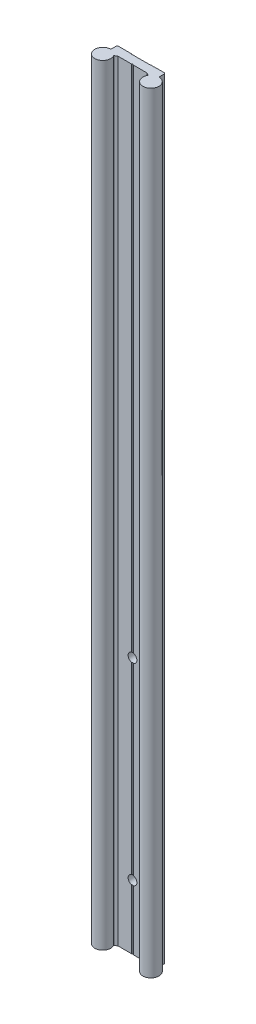
ISO-10303-21;
HEADER;
FILE_DESCRIPTION(('STEP AP214'),'2;1');
FILE_NAME('part.step','',(''),(''),'','','');
FILE_SCHEMA(('AUTOMOTIVE_DESIGN { 1 0 10303 214 1 1 1 1 }'));
ENDSEC;
DATA;
#1=APPLICATION_CONTEXT('core data for automotive mechanical design processes');
#2=APPLICATION_PROTOCOL_DEFINITION('international standard','automotive_design',2000,#1);
#3=PRODUCT_CONTEXT('',#1,'mechanical');
#4=PRODUCT('Part','Part','',(#3));
#5=PRODUCT_RELATED_PRODUCT_CATEGORY('part','',(#4));
#6=PRODUCT_DEFINITION_FORMATION('','',#4);
#7=PRODUCT_DEFINITION_CONTEXT('part definition',#1,'design');
#8=PRODUCT_DEFINITION('design','',#6,#7);
#9=PRODUCT_DEFINITION_SHAPE('','',#8);
#10=(LENGTH_UNIT() NAMED_UNIT(*) SI_UNIT(.MILLI.,.METRE.));
#11=(NAMED_UNIT(*) PLANE_ANGLE_UNIT() SI_UNIT($,.RADIAN.));
#12=(NAMED_UNIT(*) SI_UNIT($,.STERADIAN.) SOLID_ANGLE_UNIT());
#13=UNCERTAINTY_MEASURE_WITH_UNIT(LENGTH_MEASURE(1.E-05),#10,'distance_accuracy_value','');
#14=(GEOMETRIC_REPRESENTATION_CONTEXT(3) GLOBAL_UNCERTAINTY_ASSIGNED_CONTEXT((#13)) GLOBAL_UNIT_ASSIGNED_CONTEXT((#10,
#11,#12)) REPRESENTATION_CONTEXT('',''));
#15=CARTESIAN_POINT('',(0.,0.,0.));
#16=DIRECTION('',(0.,0.,1.));
#17=DIRECTION('',(1.,0.,0.));
#18=AXIS2_PLACEMENT_3D('',#15,#16,#17);
#19=CARTESIAN_POINT('',(6.85,0.,0.));
#20=DIRECTION('',(0.,0.,-1.));
#21=DIRECTION('',(-1.,0.,0.));
#22=AXIS2_PLACEMENT_3D('',#19,#20,#21);
#23=PLANE('',#22);
#24=DIRECTION('',(-1.,0.,0.));
#25=VECTOR('',#24,1.);
#26=CARTESIAN_POINT('',(6.85,0.,0.));
#27=LINE('',#26,#25);
#28=CARTESIAN_POINT('',(7.7,0.,0.));
#29=VERTEX_POINT('',#28);
#30=CARTESIAN_POINT('',(6.,0.,0.));
#31=VERTEX_POINT('',#30);
#32=EDGE_CURVE('E151',#29,#31,#27,.T.);
#33=ORIENTED_EDGE('',*,*,#32,.T.);
#34=DIRECTION('',(0.,1.,0.));
#35=VECTOR('',#34,1.);
#36=CARTESIAN_POINT('',(6.,0.,0.));
#37=LINE('',#36,#35);
#38=CARTESIAN_POINT('',(6.,480.,0.));
#39=VERTEX_POINT('',#38);
#40=EDGE_CURVE('E216',#39,#31,#37,.F.);
#41=ORIENTED_EDGE('',*,*,#40,.F.);
#42=DIRECTION('',(-1.,0.,0.));
#43=VECTOR('',#42,1.);
#44=CARTESIAN_POINT('',(7.7,480.,0.));
#45=LINE('',#44,#43);
#46=CARTESIAN_POINT('',(7.7,480.,0.));
#47=VERTEX_POINT('',#46);
#48=EDGE_CURVE('E382',#47,#39,#45,.T.);
#49=ORIENTED_EDGE('',*,*,#48,.F.);
#50=DIRECTION('',(0.,1.,0.));
#51=VECTOR('',#50,1.);
#52=CARTESIAN_POINT('',(7.7,0.,0.));
#53=LINE('',#52,#51);
#54=EDGE_CURVE('E212',#47,#29,#53,.F.);
#55=ORIENTED_EDGE('',*,*,#54,.T.);
#56=EDGE_LOOP('',(#33,#41,#49,#55));
#57=FACE_BOUND('',#56,.T.);
#58=ADVANCED_FACE('F35',(#57),#23,.T.);
#59=CARTESIAN_POINT('',(-10.2815216572,0.,6.5862970296));
#60=DIRECTION('',(0.,1.,0.));
#61=DIRECTION('',(0.,0.,1.));
#62=AXIS2_PLACEMENT_3D('',#59,#60,#61);
#63=CYLINDRICAL_SURFACE('',#62,0.29999999510001);
#64=DIRECTION('',(0.,1.,0.));
#65=VECTOR('',#64,1.);
#66=CARTESIAN_POINT('',(-10.5486053299433,0.,6.72292172997375));
#67=LINE('',#66,#65);
#68=CARTESIAN_POINT('',(-10.5486053314615,0.,6.72292172711886));
#69=VERTEX_POINT('',#68);
#70=CARTESIAN_POINT('',(-10.5486053314457,480.,6.72292172711078));
#71=VERTEX_POINT('',#70);
#72=EDGE_CURVE('E221',#69,#71,#67,.T.);
#73=ORIENTED_EDGE('',*,*,#72,.F.);
#74=CARTESIAN_POINT('',(-10.2815216572,0.,6.5862970296));
#75=DIRECTION('',(0.,1.,0.));
#76=DIRECTION('',(0.,0.,1.));
#77=AXIS2_PLACEMENT_3D('',#74,#75,#76);
#78=CIRCLE('',#77,0.29999999510001);
#79=CARTESIAN_POINT('',(-10.4315216523691,0.,6.32648941136778));
#80=VERTEX_POINT('',#79);
#81=EDGE_CURVE('E38',#80,#69,#78,.T.);
#82=ORIENTED_EDGE('',*,*,#81,.F.);
#83=DIRECTION('',(0.,1.,0.));
#84=VECTOR('',#83,1.);
#85=CARTESIAN_POINT('',(-10.43152165,0.,6.32648941));
#86=LINE('',#85,#84);
#87=CARTESIAN_POINT('',(-10.4315216523571,480.,6.32648941138856));
#88=VERTEX_POINT('',#87);
#89=EDGE_CURVE('E225',#88,#80,#86,.F.);
#90=ORIENTED_EDGE('',*,*,#89,.F.);
#91=CARTESIAN_POINT('',(-10.2815216572,480.,6.5862970296));
#92=DIRECTION('',(0.,-1.,0.));
#93=DIRECTION('',(0.,0.,1.));
#94=AXIS2_PLACEMENT_3D('',#91,#92,#93);
#95=CIRCLE('',#94,0.299999995046371);
#96=EDGE_CURVE('E310',#71,#88,#95,.T.);
#97=ORIENTED_EDGE('',*,*,#96,.F.);
#98=EDGE_LOOP('',(#73,#82,#90,#97));
#99=FACE_BOUND('',#98,.T.);
#100=ADVANCED_FACE('F308',(#99),#63,.F.);
#101=CARTESIAN_POINT('',(-15.3000000092,0.,3.7084973748));
#102=DIRECTION('',(0.,1.,0.));
#103=DIRECTION('',(0.,0.,1.));
#104=AXIS2_PLACEMENT_3D('',#101,#102,#103);
#105=CYLINDRICAL_SURFACE('',#104,0.3000000092);
#106=DIRECTION('',(0.,1.,0.));
#107=VECTOR('',#106,1.);
#108=CARTESIAN_POINT('',(-15.,0.,3.70849738000352));
#109=LINE('',#108,#107);
#110=CARTESIAN_POINT('',(-15.,0.,3.70849737740176));
#111=VERTEX_POINT('',#110);
#112=CARTESIAN_POINT('',(-15.,480.,3.70849737740176));
#113=VERTEX_POINT('',#112);
#114=EDGE_CURVE('E440',#111,#113,#109,.T.);
#115=ORIENTED_EDGE('',*,*,#114,.F.);
#116=CARTESIAN_POINT('',(-15.3000000092,0.,3.7084973748));
#117=DIRECTION('',(0.,1.,0.));
#118=DIRECTION('',(0.,0.,1.));
#119=AXIS2_PLACEMENT_3D('',#116,#117,#118);
#120=CIRCLE('',#119,0.3000000092);
#121=CARTESIAN_POINT('',(-15.2830188731145,0.,4.00801640011349));
#122=VERTEX_POINT('',#121);
#123=EDGE_CURVE('E217',#122,#111,#120,.T.);
#124=ORIENTED_EDGE('',*,*,#123,.F.);
#125=DIRECTION('',(0.,1.,0.));
#126=VECTOR('',#125,1.);
#127=CARTESIAN_POINT('',(-15.2830188699971,0.,4.00801639991588));
#128=LINE('',#127,#126);
#129=CARTESIAN_POINT('',(-15.2830188731136,480.,4.00801640012909));
#130=VERTEX_POINT('',#129);
#131=EDGE_CURVE('E314',#130,#122,#128,.F.);
#132=ORIENTED_EDGE('',*,*,#131,.F.);
#133=CARTESIAN_POINT('',(-15.3000000092,480.,3.7084973748));
#134=DIRECTION('',(0.,-1.,0.));
#135=DIRECTION('',(0.,0.,1.));
#136=AXIS2_PLACEMENT_3D('',#133,#134,#135);
#137=CIRCLE('',#136,0.30000000919479);
#138=EDGE_CURVE('E403',#113,#130,#137,.T.);
#139=ORIENTED_EDGE('',*,*,#138,.F.);
#140=EDGE_LOOP('',(#115,#124,#132,#139));
#141=FACE_BOUND('',#140,.T.);
#142=ADVANCED_FACE('F490',(#141),#105,.F.);
#143=CARTESIAN_POINT('',(-14.75,0.,0.25));
#144=DIRECTION('',(-0.707106781186548,0.,-0.707106781186548));
#145=DIRECTION('',(-0.707106781186548,0.,0.707106781186548));
#146=AXIS2_PLACEMENT_3D('',#143,#144,#145);
#147=PLANE('',#146);
#148=DIRECTION('',(-0.707106781186548,0.,0.707106781186548));
#149=VECTOR('',#148,1.);
#150=CARTESIAN_POINT('',(-14.75,0.,0.25));
#151=LINE('',#150,#149);
#152=CARTESIAN_POINT('',(-14.5,0.,0.));
#153=VERTEX_POINT('',#152);
#154=CARTESIAN_POINT('',(-15.,0.,0.5));
#155=VERTEX_POINT('',#154);
#156=EDGE_CURVE('E214',#153,#155,#151,.T.);
#157=ORIENTED_EDGE('',*,*,#156,.T.);
#158=DIRECTION('',(0.,1.,0.));
#159=VECTOR('',#158,1.);
#160=CARTESIAN_POINT('',(-15.,0.,0.5));
#161=LINE('',#160,#159);
#162=CARTESIAN_POINT('',(-15.,480.,0.5));
#163=VERTEX_POINT('',#162);
#164=EDGE_CURVE('E317',#163,#155,#161,.F.);
#165=ORIENTED_EDGE('',*,*,#164,.F.);
#166=DIRECTION('',(-0.707106781186547,0.,0.707106781186548));
#167=VECTOR('',#166,1.);
#168=CARTESIAN_POINT('',(-14.5,480.,0.));
#169=LINE('',#168,#167);
#170=CARTESIAN_POINT('',(-14.5,480.,0.));
#171=VERTEX_POINT('',#170);
#172=EDGE_CURVE('E397',#171,#163,#169,.T.);
#173=ORIENTED_EDGE('',*,*,#172,.F.);
#174=DIRECTION('',(0.,1.,0.));
#175=VECTOR('',#174,1.);
#176=CARTESIAN_POINT('',(-14.5,0.,0.));
#177=LINE('',#176,#175);
#178=EDGE_CURVE('E240',#153,#171,#177,.T.);
#179=ORIENTED_EDGE('',*,*,#178,.F.);
#180=EDGE_LOOP('',(#157,#165,#173,#179));
#181=FACE_BOUND('',#180,.T.);
#182=ADVANCED_FACE('F453',(#181),#147,.T.);
#183=CARTESIAN_POINT('',(5.9,0.,0.1));
#184=DIRECTION('',(-0.707106781186547,0.,-0.707106781186548));
#185=DIRECTION('',(-0.707106781186548,0.,0.707106781186547));
#186=AXIS2_PLACEMENT_3D('',#183,#184,#185);
#187=PLANE('',#186);
#188=DIRECTION('',(-0.707106781186548,0.,0.707106781186547));
#189=VECTOR('',#188,1.);
#190=CARTESIAN_POINT('',(5.9,0.,0.1));
#191=LINE('',#190,#189);
#192=CARTESIAN_POINT('',(5.8,0.,0.2));
#193=VERTEX_POINT('',#192);
#194=EDGE_CURVE('E213',#31,#193,#191,.T.);
#195=ORIENTED_EDGE('',*,*,#194,.T.);
#196=DIRECTION('',(0.,1.,0.));
#197=VECTOR('',#196,1.);
#198=CARTESIAN_POINT('',(5.8,0.,0.2));
#199=LINE('',#198,#197);
#200=CARTESIAN_POINT('',(5.8,480.,0.2));
#201=VERTEX_POINT('',#200);
#202=EDGE_CURVE('E276',#201,#193,#199,.F.);
#203=ORIENTED_EDGE('',*,*,#202,.F.);
#204=DIRECTION('',(-0.707106781186547,0.,0.707106781186547));
#205=VECTOR('',#204,1.);
#206=CARTESIAN_POINT('',(6.,480.,0.));
#207=LINE('',#206,#205);
#208=EDGE_CURVE('E385',#39,#201,#207,.T.);
#209=ORIENTED_EDGE('',*,*,#208,.F.);
#210=ORIENTED_EDGE('',*,*,#40,.T.);
#211=EDGE_LOOP('',(#195,#203,#209,#210));
#212=FACE_BOUND('',#211,.T.);
#213=ADVANCED_FACE('F746',(#212),#187,.T.);
#214=CARTESIAN_POINT('',(-5.9,0.,0.1));
#215=DIRECTION('',(0.707106781186547,0.,-0.707106781186548));
#216=DIRECTION('',(-0.707106781186548,0.,-0.707106781186547));
#217=AXIS2_PLACEMENT_3D('',#214,#215,#216);
#218=PLANE('',#217);
#219=DIRECTION('',(-0.707106781186548,0.,-0.707106781186547));
#220=VECTOR('',#219,1.);
#221=CARTESIAN_POINT('',(-5.9,0.,0.1));
#222=LINE('',#221,#220);
#223=CARTESIAN_POINT('',(-5.8,0.,0.2));
#224=VERTEX_POINT('',#223);
#225=CARTESIAN_POINT('',(-6.,0.,0.));
#226=VERTEX_POINT('',#225);
#227=EDGE_CURVE('E210',#224,#226,#222,.T.);
#228=ORIENTED_EDGE('',*,*,#227,.T.);
#229=DIRECTION('',(0.,1.,0.));
#230=VECTOR('',#229,1.);
#231=CARTESIAN_POINT('',(-6.,0.,0.));
#232=LINE('',#231,#230);
#233=CARTESIAN_POINT('',(-6.,480.,0.));
#234=VERTEX_POINT('',#233);
#235=EDGE_CURVE('E244',#234,#226,#232,.F.);
#236=ORIENTED_EDGE('',*,*,#235,.F.);
#237=DIRECTION('',(-0.707106781186549,0.,-0.707106781186546));
#238=VECTOR('',#237,1.);
#239=CARTESIAN_POINT('',(-5.8,480.,0.2));
#240=LINE('',#239,#238);
#241=CARTESIAN_POINT('',(-5.8,480.,0.2));
#242=VERTEX_POINT('',#241);
#243=EDGE_CURVE('E391',#242,#234,#240,.T.);
#244=ORIENTED_EDGE('',*,*,#243,.F.);
#245=DIRECTION('',(0.,1.,0.));
#246=VECTOR('',#245,1.);
#247=CARTESIAN_POINT('',(-5.8,0.,0.2));
#248=LINE('',#247,#246);
#249=EDGE_CURVE('E433',#224,#242,#248,.T.);
#250=ORIENTED_EDGE('',*,*,#249,.F.);
#251=EDGE_LOOP('',(#228,#236,#244,#250));
#252=FACE_BOUND('',#251,.T.);
#253=ADVANCED_FACE('F462',(#252),#218,.T.);
#254=CARTESIAN_POINT('',(8.,0.,0.));
#255=DIRECTION('',(0.,1.,0.));
#256=DIRECTION('',(0.,0.,1.));
#257=AXIS2_PLACEMENT_3D('',#254,#255,#256);
#258=CYLINDRICAL_SURFACE('',#257,0.300000000000001);
#259=DIRECTION('',(0.,1.,0.));
#260=VECTOR('',#259,1.);
#261=CARTESIAN_POINT('',(8.3,0.,0.));
#262=LINE('',#261,#260);
#263=CARTESIAN_POINT('',(8.3,0.,0.));
#264=VERTEX_POINT('',#263);
#265=CARTESIAN_POINT('',(8.3,480.,0.));
#266=VERTEX_POINT('',#265);
#267=EDGE_CURVE('E427',#264,#266,#262,.T.);
#268=ORIENTED_EDGE('',*,*,#267,.F.);
#269=CARTESIAN_POINT('',(8.,0.,0.));
#270=DIRECTION('',(0.,1.,0.));
#271=DIRECTION('',(0.,0.,1.));
#272=AXIS2_PLACEMENT_3D('',#269,#270,#271);
#273=CIRCLE('',#272,0.300000000000001);
#274=EDGE_CURVE('E209',#29,#264,#273,.T.);
#275=ORIENTED_EDGE('',*,*,#274,.F.);
#276=ORIENTED_EDGE('',*,*,#54,.F.);
#277=CARTESIAN_POINT('',(8.,480.,0.));
#278=DIRECTION('',(0.,-1.,0.));
#279=DIRECTION('',(0.,0.,1.));
#280=AXIS2_PLACEMENT_3D('',#277,#278,#279);
#281=CIRCLE('',#280,0.300000000000002);
#282=EDGE_CURVE('E379',#266,#47,#281,.T.);
#283=ORIENTED_EDGE('',*,*,#282,.F.);
#284=EDGE_LOOP('',(#268,#275,#276,#283));
#285=FACE_BOUND('',#284,.T.);
#286=ADVANCED_FACE('F724',(#285),#258,.F.);
#287=CARTESIAN_POINT('',(14.75,0.,0.25));
#288=DIRECTION('',(0.707106781186548,0.,-0.707106781186548));
#289=DIRECTION('',(-0.707106781186548,0.,-0.707106781186548));
#290=AXIS2_PLACEMENT_3D('',#287,#288,#289);
#291=PLANE('',#290);
#292=DIRECTION('',(-0.707106781186548,0.,-0.707106781186548));
#293=VECTOR('',#292,1.);
#294=CARTESIAN_POINT('',(14.75,0.,0.25));
#295=LINE('',#294,#293);
#296=CARTESIAN_POINT('',(15.,0.,0.5));
#297=VERTEX_POINT('',#296);
#298=CARTESIAN_POINT('',(14.5,0.,0.));
#299=VERTEX_POINT('',#298);
#300=EDGE_CURVE('E188',#297,#299,#295,.T.);
#301=ORIENTED_EDGE('',*,*,#300,.T.);
#302=DIRECTION('',(0.,1.,0.));
#303=VECTOR('',#302,1.);
#304=CARTESIAN_POINT('',(14.5,0.,0.));
#305=LINE('',#304,#303);
#306=CARTESIAN_POINT('',(14.5,480.,0.));
#307=VERTEX_POINT('',#306);
#308=EDGE_CURVE('E430',#307,#299,#305,.F.);
#309=ORIENTED_EDGE('',*,*,#308,.F.);
#310=DIRECTION('',(-0.707106781186547,0.,-0.707106781186548));
#311=VECTOR('',#310,1.);
#312=CARTESIAN_POINT('',(15.,480.,0.5));
#313=LINE('',#312,#311);
#314=CARTESIAN_POINT('',(15.,480.,0.5));
#315=VERTEX_POINT('',#314);
#316=EDGE_CURVE('E373',#315,#307,#313,.T.);
#317=ORIENTED_EDGE('',*,*,#316,.F.);
#318=DIRECTION('',(0.,1.,0.));
#319=VECTOR('',#318,1.);
#320=CARTESIAN_POINT('',(15.,0.,0.5));
#321=LINE('',#320,#319);
#322=EDGE_CURVE('E272',#297,#315,#321,.T.);
#323=ORIENTED_EDGE('',*,*,#322,.F.);
#324=EDGE_LOOP('',(#301,#309,#317,#323));
#325=FACE_BOUND('',#324,.T.);
#326=ADVANCED_FACE('F719',(#325),#291,.T.);
#327=CARTESIAN_POINT('',(0.25,0.,5.355662435));
#328=DIRECTION('',(-0.499999994031163,0.,0.866025407230548));
#329=DIRECTION('',(0.866025407230548,0.,0.499999994031163));
#330=AXIS2_PLACEMENT_3D('',#327,#328,#329);
#331=PLANE('',#330);
#332=CARTESIAN_POINT('',(0.,40.,5.21132487));
#333=DIRECTION('',(-0.499999994031163,0.,0.866025407230548));
#334=DIRECTION('',(-0.866025407230548,0.,-0.499999994031163));
#335=AXIS2_PLACEMENT_3D('',#332,#333,#334);
#336=ELLIPSE('',#335,3.17542646790721,2.75);
#337=CARTESIAN_POINT('',(0.,42.75,5.21132487));
#338=VERTEX_POINT('',#337);
#339=CARTESIAN_POINT('',(0.499999999999999,42.704163456598,5.5));
#340=VERTEX_POINT('',#339);
#341=EDGE_CURVE('E287',#338,#340,#336,.F.);
#342=ORIENTED_EDGE('',*,*,#341,.T.);
#343=DIRECTION('',(0.,1.,0.));
#344=VECTOR('',#343,1.);
#345=CARTESIAN_POINT('',(0.5,0.,5.5));
#346=LINE('',#345,#344);
#347=CARTESIAN_POINT('',(0.499999999999999,157.295836543402,5.5));
#348=VERTEX_POINT('',#347);
#349=EDGE_CURVE('E268',#348,#340,#346,.F.);
#350=ORIENTED_EDGE('',*,*,#349,.F.);
#351=CARTESIAN_POINT('',(0.,160.,5.21132487));
#352=DIRECTION('',(-0.499999994031163,0.,0.866025407230548));
#353=DIRECTION('',(-0.866025407230548,0.,-0.499999994031163));
#354=AXIS2_PLACEMENT_3D('',#351,#352,#353);
#355=ELLIPSE('',#354,3.17542646790721,2.75);
#356=CARTESIAN_POINT('',(0.,157.25,5.21132487));
#357=VERTEX_POINT('',#356);
#358=EDGE_CURVE('E224',#348,#357,#355,.F.);
#359=ORIENTED_EDGE('',*,*,#358,.T.);
#360=DIRECTION('',(0.,1.,0.));
#361=VECTOR('',#360,1.);
#362=CARTESIAN_POINT('',(0.,0.,5.21132487));
#363=LINE('',#362,#361);
#364=EDGE_CURVE('E280',#338,#357,#363,.T.);
#365=ORIENTED_EDGE('',*,*,#364,.F.);
#366=EDGE_LOOP('',(#342,#350,#359,#365));
#367=FACE_BOUND('',#366,.T.);
#368=ADVANCED_FACE('F723',(#367),#331,.T.);
#369=CARTESIAN_POINT('',(0.25,0.,5.355662435));
#370=DIRECTION('',(-0.499999994031163,0.,0.866025407230548));
#371=DIRECTION('',(0.866025407230548,0.,0.499999994031163));
#372=AXIS2_PLACEMENT_3D('',#369,#370,#371);
#373=PLANE('',#372);
#374=DIRECTION('',(0.866025407230548,0.,0.499999994031163));
#375=VECTOR('',#374,1.);
#376=CARTESIAN_POINT('',(0.25,0.,5.355662435));
#377=LINE('',#376,#375);
#378=CARTESIAN_POINT('',(0.,0.,5.21132487));
#379=VERTEX_POINT('',#378);
#380=CARTESIAN_POINT('',(0.5,0.,5.5));
#381=VERTEX_POINT('',#380);
#382=EDGE_CURVE('E132',#379,#381,#377,.T.);
#383=ORIENTED_EDGE('',*,*,#382,.T.);
#384=DIRECTION('',(0.,1.,0.));
#385=VECTOR('',#384,1.);
#386=CARTESIAN_POINT('',(0.5,0.,5.5));
#387=LINE('',#386,#385);
#388=CARTESIAN_POINT('',(0.499999999999999,37.295836543402,5.5));
#389=VERTEX_POINT('',#388);
#390=EDGE_CURVE('E183',#389,#381,#387,.F.);
#391=ORIENTED_EDGE('',*,*,#390,.F.);
#392=CARTESIAN_POINT('',(0.,40.,5.21132487));
#393=DIRECTION('',(-0.499999994031163,0.,0.866025407230548));
#394=DIRECTION('',(-0.866025407230548,0.,-0.499999994031163));
#395=AXIS2_PLACEMENT_3D('',#392,#393,#394);
#396=ELLIPSE('',#395,3.17542646790721,2.75);
#397=CARTESIAN_POINT('',(0.,37.25,5.21132487));
#398=VERTEX_POINT('',#397);
#399=EDGE_CURVE('E293',#389,#398,#396,.F.);
#400=ORIENTED_EDGE('',*,*,#399,.T.);
#401=DIRECTION('',(0.,1.,0.));
#402=VECTOR('',#401,1.);
#403=CARTESIAN_POINT('',(0.,0.,5.21132487));
#404=LINE('',#403,#402);
#405=EDGE_CURVE('E186',#379,#398,#404,.T.);
#406=ORIENTED_EDGE('',*,*,#405,.F.);
#407=EDGE_LOOP('',(#383,#391,#400,#406));
#408=FACE_BOUND('',#407,.T.);
#409=ADVANCED_FACE('F182',(#408),#373,.T.);
#410=CARTESIAN_POINT('',(9.71576082500376,0.,5.91324470500217));
#411=DIRECTION('',(-0.500000000009856,0.,0.866025403778748));
#412=DIRECTION('',(0.866025403778748,0.,0.500000000009856));
#413=AXIS2_PLACEMENT_3D('',#410,#411,#412);
#414=PLANE('',#413);
#415=DIRECTION('',(0.866025403778748,0.,0.500000000009856));
#416=VECTOR('',#415,1.);
#417=CARTESIAN_POINT('',(9.71576082500376,0.,5.91324470500217));
#418=LINE('',#417,#416);
#419=CARTESIAN_POINT('',(9.,0.,5.5));
#420=VERTEX_POINT('',#419);
#421=CARTESIAN_POINT('',(10.4315216523802,0.,6.32648941135711));
#422=VERTEX_POINT('',#421);
#423=EDGE_CURVE('E177',#420,#422,#418,.T.);
#424=ORIENTED_EDGE('',*,*,#423,.T.);
#425=DIRECTION('',(0.,1.,0.));
#426=VECTOR('',#425,1.);
#427=CARTESIAN_POINT('',(10.4315216500223,0.,6.32648940997866));
#428=LINE('',#427,#426);
#429=CARTESIAN_POINT('',(10.4315216523802,480.,6.32648941135711));
#430=VERTEX_POINT('',#429);
#431=EDGE_CURVE('E218',#422,#430,#428,.T.);
#432=ORIENTED_EDGE('',*,*,#431,.T.);
#433=DIRECTION('',(0.866025403783231,0.,0.500000000002092));
#434=VECTOR('',#433,1.);
#435=CARTESIAN_POINT('',(9.,480.,5.5));
#436=LINE('',#435,#434);
#437=CARTESIAN_POINT('',(9.,480.,5.5));
#438=VERTEX_POINT('',#437);
#439=EDGE_CURVE('E355',#438,#430,#436,.T.);
#440=ORIENTED_EDGE('',*,*,#439,.F.);
#441=DIRECTION('',(0.,1.,0.));
#442=VECTOR('',#441,1.);
#443=CARTESIAN_POINT('',(9.,0.,5.5));
#444=LINE('',#443,#442);
#445=EDGE_CURVE('E197',#420,#438,#444,.T.);
#446=ORIENTED_EDGE('',*,*,#445,.F.);
#447=EDGE_LOOP('',(#424,#432,#440,#446));
#448=FACE_BOUND('',#447,.T.);
#449=ADVANCED_FACE('F596',(#448),#414,.T.);
#450=CARTESIAN_POINT('',(0.25,0.,5.355662435));
#451=DIRECTION('',(-0.499999994031163,0.,0.866025407230548));
#452=DIRECTION('',(0.866025407230548,0.,0.499999994031163));
#453=AXIS2_PLACEMENT_3D('',#450,#451,#452);
#454=PLANE('',#453);
#455=DIRECTION('',(0.,1.,0.));
#456=VECTOR('',#455,1.);
#457=CARTESIAN_POINT('',(0.5,0.,5.5));
#458=LINE('',#457,#456);
#459=CARTESIAN_POINT('',(0.5,480.,5.5));
#460=VERTEX_POINT('',#459);
#461=CARTESIAN_POINT('',(0.499999999999999,162.704163456598,5.5));
#462=VERTEX_POINT('',#461);
#463=EDGE_CURVE('E236',#460,#462,#458,.F.);
#464=ORIENTED_EDGE('',*,*,#463,.F.);
#465=DIRECTION('',(0.866025407230549,0.,0.499999994031162));
#466=VECTOR('',#465,1.);
#467=CARTESIAN_POINT('',(0.,480.,5.21132487));
#468=LINE('',#467,#466);
#469=CARTESIAN_POINT('',(0.,480.,5.21132487));
#470=VERTEX_POINT('',#469);
#471=EDGE_CURVE('E345',#470,#460,#468,.T.);
#472=ORIENTED_EDGE('',*,*,#471,.F.);
#473=DIRECTION('',(0.,1.,0.));
#474=VECTOR('',#473,1.);
#475=CARTESIAN_POINT('',(0.,0.,5.21132487));
#476=LINE('',#475,#474);
#477=CARTESIAN_POINT('',(0.,162.75,5.21132487));
#478=VERTEX_POINT('',#477);
#479=EDGE_CURVE('E229',#478,#470,#476,.T.);
#480=ORIENTED_EDGE('',*,*,#479,.F.);
#481=CARTESIAN_POINT('',(0.,160.,5.21132487));
#482=DIRECTION('',(-0.499999994031163,0.,0.866025407230548));
#483=DIRECTION('',(-0.866025407230548,0.,-0.499999994031163));
#484=AXIS2_PLACEMENT_3D('',#481,#482,#483);
#485=ELLIPSE('',#484,3.17542646790721,2.75);
#486=EDGE_CURVE('E298',#478,#462,#485,.F.);
#487=ORIENTED_EDGE('',*,*,#486,.T.);
#488=EDGE_LOOP('',(#464,#472,#480,#487));
#489=FACE_BOUND('',#488,.T.);
#490=ADVANCED_FACE('F351',(#489),#454,.T.);
#491=CARTESIAN_POINT('',(0.,160.,2.85));
#492=DIRECTION('',(0.,0.,-1.));
#493=DIRECTION('',(-1.,0.,0.));
#494=AXIS2_PLACEMENT_3D('',#491,#492,#493);
#495=CYLINDRICAL_SURFACE('',#494,2.75);
#496=CARTESIAN_POINT('',(0.,160.,5.5));
#497=DIRECTION('',(0.,0.,-1.));
#498=DIRECTION('',(-1.,0.,0.));
#499=AXIS2_PLACEMENT_3D('',#496,#497,#498);
#500=CIRCLE('',#499,2.75);
#501=CARTESIAN_POINT('',(-0.499999999999999,157.295836543402,5.5));
#502=VERTEX_POINT('',#501);
#503=CARTESIAN_POINT('',(-0.499999999999999,162.704163456598,5.5));
#504=VERTEX_POINT('',#503);
#505=EDGE_CURVE('E264',#502,#504,#500,.T.);
#506=ORIENTED_EDGE('',*,*,#505,.F.);
#507=CARTESIAN_POINT('',(0.,160.,5.21132487));
#508=DIRECTION('',(0.499999994031163,0.,0.866025407230548));
#509=DIRECTION('',(0.866025407230548,0.,-0.499999994031163));
#510=AXIS2_PLACEMENT_3D('',#507,#508,#509);
#511=ELLIPSE('',#510,3.17542646790721,2.75);
#512=EDGE_CURVE('E284',#357,#502,#511,.F.);
#513=ORIENTED_EDGE('',*,*,#512,.F.);
#514=ORIENTED_EDGE('',*,*,#358,.F.);
#515=CARTESIAN_POINT('',(0.,160.,5.5));
#516=DIRECTION('',(0.,0.,-1.));
#517=DIRECTION('',(-1.,0.,0.));
#518=AXIS2_PLACEMENT_3D('',#515,#516,#517);
#519=CIRCLE('',#518,2.75);
#520=EDGE_CURVE('E269',#462,#348,#519,.T.);
#521=ORIENTED_EDGE('',*,*,#520,.F.);
#522=ORIENTED_EDGE('',*,*,#486,.F.);
#523=CARTESIAN_POINT('',(0.,160.,5.21132487));
#524=DIRECTION('',(0.499999994031163,0.,0.866025407230548));
#525=DIRECTION('',(0.866025407230548,0.,-0.499999994031163));
#526=AXIS2_PLACEMENT_3D('',#523,#524,#525);
#527=ELLIPSE('',#526,3.17542646790721,2.75);
#528=EDGE_CURVE('E295',#504,#478,#527,.F.);
#529=ORIENTED_EDGE('',*,*,#528,.F.);
#530=EDGE_LOOP('',(#506,#513,#514,#521,#522,#529));
#531=FACE_BOUND('',#530,.T.);
#532=CARTESIAN_POINT('',(0.,160.,0.2));
#533=DIRECTION('',(0.,0.,-1.));
#534=DIRECTION('',(-1.,0.,0.));
#535=AXIS2_PLACEMENT_3D('',#532,#533,#534);
#536=CIRCLE('',#535,2.75);
#537=CARTESIAN_POINT('',(-2.75,160.,0.2));
#538=VERTEX_POINT('',#537);
#539=EDGE_CURVE('E243',#538,#538,#536,.F.);
#540=ORIENTED_EDGE('',*,*,#539,.F.);
#541=EDGE_LOOP('',(#540));
#542=FACE_BOUND('',#541,.T.);
#543=ADVANCED_FACE('F595',(#531,#542),#495,.F.);
#544=CARTESIAN_POINT('',(-0.25,0.,5.355662435));
#545=DIRECTION('',(0.499999994031163,0.,0.866025407230548));
#546=DIRECTION('',(0.866025407230548,0.,-0.499999994031163));
#547=AXIS2_PLACEMENT_3D('',#544,#545,#546);
#548=PLANE('',#547);
#549=ORIENTED_EDGE('',*,*,#479,.T.);
#550=DIRECTION('',(0.866025407230549,0.,-0.499999994031162));
#551=VECTOR('',#550,1.);
#552=CARTESIAN_POINT('',(-0.5,480.,5.5));
#553=LINE('',#552,#551);
#554=CARTESIAN_POINT('',(-0.5,480.,5.5));
#555=VERTEX_POINT('',#554);
#556=EDGE_CURVE('E335',#555,#470,#553,.T.);
#557=ORIENTED_EDGE('',*,*,#556,.F.);
#558=DIRECTION('',(0.,1.,0.));
#559=VECTOR('',#558,1.);
#560=CARTESIAN_POINT('',(-0.5,0.,5.5));
#561=LINE('',#560,#559);
#562=EDGE_CURVE('E234',#504,#555,#561,.T.);
#563=ORIENTED_EDGE('',*,*,#562,.F.);
#564=ORIENTED_EDGE('',*,*,#528,.T.);
#565=EDGE_LOOP('',(#549,#557,#563,#564));
#566=FACE_BOUND('',#565,.T.);
#567=ADVANCED_FACE('F332',(#566),#548,.T.);
#568=CARTESIAN_POINT('',(-9.715760825,0.,5.913244705));
#569=DIRECTION('',(0.500000000009856,0.,0.866025403778748));
#570=DIRECTION('',(0.866025403778748,0.,-0.500000000009856));
#571=AXIS2_PLACEMENT_3D('',#568,#569,#570);
#572=PLANE('',#571);
#573=DIRECTION('',(0.866025403778748,0.,-0.500000000009856));
#574=VECTOR('',#573,1.);
#575=CARTESIAN_POINT('',(-9.715760825,0.,5.913244705));
#576=LINE('',#575,#574);
#577=CARTESIAN_POINT('',(-9.,0.,5.5));
#578=VERTEX_POINT('',#577);
#579=EDGE_CURVE('E228',#80,#578,#576,.T.);
#580=ORIENTED_EDGE('',*,*,#579,.T.);
#581=DIRECTION('',(0.,1.,0.));
#582=VECTOR('',#581,1.);
#583=CARTESIAN_POINT('',(-9.,0.,5.5));
#584=LINE('',#583,#582);
#585=CARTESIAN_POINT('',(-9.,480.,5.5));
#586=VERTEX_POINT('',#585);
#587=EDGE_CURVE('E160',#586,#578,#584,.F.);
#588=ORIENTED_EDGE('',*,*,#587,.F.);
#589=DIRECTION('',(0.866025403775453,0.,-0.500000000015564));
#590=VECTOR('',#589,1.);
#591=CARTESIAN_POINT('',(-10.4315216523636,480.,6.32648941137722));
#592=LINE('',#591,#590);
#593=EDGE_CURVE('E239',#88,#586,#592,.T.);
#594=ORIENTED_EDGE('',*,*,#593,.F.);
#595=ORIENTED_EDGE('',*,*,#89,.T.);
#596=EDGE_LOOP('',(#580,#588,#594,#595));
#597=FACE_BOUND('',#596,.T.);
#598=ADVANCED_FACE('F607',(#597),#572,.T.);
#599=CARTESIAN_POINT('',(-0.25,0.,5.355662435));
#600=DIRECTION('',(0.499999994031163,0.,0.866025407230548));
#601=DIRECTION('',(0.866025407230548,0.,-0.499999994031163));
#602=AXIS2_PLACEMENT_3D('',#599,#600,#601);
#603=PLANE('',#602);
#604=DIRECTION('',(0.866025407230548,0.,-0.499999994031163));
#605=VECTOR('',#604,1.);
#606=CARTESIAN_POINT('',(-0.25,0.,5.355662435));
#607=LINE('',#606,#605);
#608=CARTESIAN_POINT('',(-0.5,0.,5.5));
#609=VERTEX_POINT('',#608);
#610=EDGE_CURVE('E231',#609,#379,#607,.T.);
#611=ORIENTED_EDGE('',*,*,#610,.T.);
#612=ORIENTED_EDGE('',*,*,#405,.T.);
#613=CARTESIAN_POINT('',(0.,40.,5.21132487));
#614=DIRECTION('',(0.499999994031163,0.,0.866025407230548));
#615=DIRECTION('',(0.866025407230548,0.,-0.499999994031163));
#616=AXIS2_PLACEMENT_3D('',#613,#614,#615);
#617=ELLIPSE('',#616,3.17542646790721,2.75);
#618=CARTESIAN_POINT('',(-0.499999999999999,37.295836543402,5.5));
#619=VERTEX_POINT('',#618);
#620=EDGE_CURVE('E290',#398,#619,#617,.F.);
#621=ORIENTED_EDGE('',*,*,#620,.T.);
#622=DIRECTION('',(0.,1.,0.));
#623=VECTOR('',#622,1.);
#624=CARTESIAN_POINT('',(-0.5,0.,5.5));
#625=LINE('',#624,#623);
#626=EDGE_CURVE('E233',#609,#619,#625,.T.);
#627=ORIENTED_EDGE('',*,*,#626,.F.);
#628=EDGE_LOOP('',(#611,#612,#621,#627));
#629=FACE_BOUND('',#628,.T.);
#630=ADVANCED_FACE('F632',(#629),#603,.T.);
#631=CARTESIAN_POINT('',(0.,40.,2.85));
#632=DIRECTION('',(0.,0.,-1.));
#633=DIRECTION('',(-1.,0.,0.));
#634=AXIS2_PLACEMENT_3D('',#631,#632,#633);
#635=CYLINDRICAL_SURFACE('',#634,2.75);
#636=CARTESIAN_POINT('',(0.,40.,5.5));
#637=DIRECTION('',(0.,0.,-1.));
#638=DIRECTION('',(-1.,0.,0.));
#639=AXIS2_PLACEMENT_3D('',#636,#637,#638);
#640=CIRCLE('',#639,2.75);
#641=CARTESIAN_POINT('',(-0.499999999999999,42.704163456598,5.5));
#642=VERTEX_POINT('',#641);
#643=EDGE_CURVE('E260',#619,#642,#640,.T.);
#644=ORIENTED_EDGE('',*,*,#643,.F.);
#645=ORIENTED_EDGE('',*,*,#620,.F.);
#646=ORIENTED_EDGE('',*,*,#399,.F.);
#647=CARTESIAN_POINT('',(0.,40.,5.5));
#648=DIRECTION('',(0.,0.,-1.));
#649=DIRECTION('',(-1.,0.,0.));
#650=AXIS2_PLACEMENT_3D('',#647,#648,#649);
#651=CIRCLE('',#650,2.75);
#652=EDGE_CURVE('E196',#340,#389,#651,.T.);
#653=ORIENTED_EDGE('',*,*,#652,.F.);
#654=ORIENTED_EDGE('',*,*,#341,.F.);
#655=CARTESIAN_POINT('',(0.,40.,5.21132487));
#656=DIRECTION('',(0.499999994031163,0.,0.866025407230548));
#657=DIRECTION('',(0.866025407230548,0.,-0.499999994031163));
#658=AXIS2_PLACEMENT_3D('',#655,#656,#657);
#659=ELLIPSE('',#658,3.17542646790721,2.75);
#660=EDGE_CURVE('E281',#642,#338,#659,.F.);
#661=ORIENTED_EDGE('',*,*,#660,.F.);
#662=EDGE_LOOP('',(#644,#645,#646,#653,#654,#661));
#663=FACE_BOUND('',#662,.T.);
#664=CARTESIAN_POINT('',(0.,40.,0.2));
#665=DIRECTION('',(0.,0.,-1.));
#666=DIRECTION('',(-1.,0.,0.));
#667=AXIS2_PLACEMENT_3D('',#664,#665,#666);
#668=CIRCLE('',#667,2.75);
#669=CARTESIAN_POINT('',(-2.75,40.,0.2));
#670=VERTEX_POINT('',#669);
#671=EDGE_CURVE('E273',#670,#670,#668,.F.);
#672=ORIENTED_EDGE('',*,*,#671,.F.);
#673=EDGE_LOOP('',(#672));
#674=FACE_BOUND('',#673,.T.);
#675=ADVANCED_FACE('F628',(#663,#674),#635,.F.);
#676=CARTESIAN_POINT('',(-0.25,0.,5.355662435));
#677=DIRECTION('',(0.499999994031163,0.,0.866025407230548));
#678=DIRECTION('',(0.866025407230548,0.,-0.499999994031163));
#679=AXIS2_PLACEMENT_3D('',#676,#677,#678);
#680=PLANE('',#679);
#681=ORIENTED_EDGE('',*,*,#660,.T.);
#682=ORIENTED_EDGE('',*,*,#364,.T.);
#683=ORIENTED_EDGE('',*,*,#512,.T.);
#684=DIRECTION('',(0.,1.,0.));
#685=VECTOR('',#684,1.);
#686=CARTESIAN_POINT('',(-0.5,0.,5.5));
#687=LINE('',#686,#685);
#688=EDGE_CURVE('E263',#642,#502,#687,.T.);
#689=ORIENTED_EDGE('',*,*,#688,.F.);
#690=EDGE_LOOP('',(#681,#682,#683,#689));
#691=FACE_BOUND('',#690,.T.);
#692=ADVANCED_FACE('F500',(#691),#680,.T.);
#693=CARTESIAN_POINT('',(10.2815216572,0.,6.5862970296));
#694=DIRECTION('',(0.,1.,0.));
#695=DIRECTION('',(0.,0.,1.));
#696=AXIS2_PLACEMENT_3D('',#693,#694,#695);
#697=CYLINDRICAL_SURFACE('',#696,0.299999995100002);
#698=ORIENTED_EDGE('',*,*,#431,.F.);
#699=CARTESIAN_POINT('',(10.2815216572,0.,6.5862970296));
#700=DIRECTION('',(0.,1.,0.));
#701=DIRECTION('',(0.,0.,1.));
#702=AXIS2_PLACEMENT_3D('',#699,#700,#701);
#703=CIRCLE('',#702,0.299999995100002);
#704=CARTESIAN_POINT('',(10.54860533147,0.,6.72292172710227));
#705=VERTEX_POINT('',#704);
#706=EDGE_CURVE('E222',#705,#422,#703,.T.);
#707=ORIENTED_EDGE('',*,*,#706,.F.);
#708=DIRECTION('',(0.,1.,0.));
#709=VECTOR('',#708,1.);
#710=CARTESIAN_POINT('',(10.5486053299603,0.,6.72292172994058));
#711=LINE('',#710,#709);
#712=CARTESIAN_POINT('',(10.5486053314944,480.,6.72292172711478));
#713=VERTEX_POINT('',#712);
#714=EDGE_CURVE('E325',#713,#705,#711,.F.);
#715=ORIENTED_EDGE('',*,*,#714,.F.);
#716=CARTESIAN_POINT('',(10.2815216572,480.,6.5862970296));
#717=DIRECTION('',(0.,-1.,0.));
#718=DIRECTION('',(0.,0.,1.));
#719=AXIS2_PLACEMENT_3D('',#716,#717,#718);
#720=CIRCLE('',#719,0.299999995076031);
#721=EDGE_CURVE('E361',#430,#713,#720,.T.);
#722=ORIENTED_EDGE('',*,*,#721,.F.);
#723=EDGE_LOOP('',(#698,#707,#715,#722));
#724=FACE_BOUND('',#723,.T.);
#725=ADVANCED_FACE('F493',(#724),#697,.F.);
#726=CARTESIAN_POINT('',(-15.0000000021,0.,9.00000000590001));
#727=DIRECTION('',(0.,1.,0.));
#728=DIRECTION('',(0.,0.,1.));
#729=AXIS2_PLACEMENT_3D('',#726,#727,#728);
#730=CYLINDRICAL_SURFACE('',#729,5.00000000020001);
#731=ORIENTED_EDGE('',*,*,#131,.T.);
#732=CARTESIAN_POINT('',(-15.0000000021,0.,9.00000000590001));
#733=DIRECTION('',(0.,1.,0.));
#734=DIRECTION('',(0.,0.,1.));
#735=AXIS2_PLACEMENT_3D('',#732,#733,#734);
#736=CIRCLE('',#735,5.00000000020001);
#737=EDGE_CURVE('E256',#69,#122,#736,.F.);
#738=ORIENTED_EDGE('',*,*,#737,.F.);
#739=ORIENTED_EDGE('',*,*,#72,.T.);
#740=CARTESIAN_POINT('',(-15.0000000021,480.,9.00000000590001));
#741=DIRECTION('',(0.,1.,0.));
#742=DIRECTION('',(0.,0.,1.));
#743=AXIS2_PLACEMENT_3D('',#740,#741,#742);
#744=CIRCLE('',#743,5.00000000016631);
#745=EDGE_CURVE('E406',#130,#71,#744,.T.);
#746=ORIENTED_EDGE('',*,*,#745,.F.);
#747=EDGE_LOOP('',(#731,#738,#739,#746));
#748=FACE_BOUND('',#747,.T.);
#749=ADVANCED_FACE('F491',(#748),#730,.T.);
#750=CARTESIAN_POINT('',(-15.,0.,2.10424869000176));
#751=DIRECTION('',(-1.,0.,0.));
#752=DIRECTION('',(0.,0.,1.));
#753=AXIS2_PLACEMENT_3D('',#750,#751,#752);
#754=PLANE('',#753);
#755=DIRECTION('',(0.,0.,-1.));
#756=VECTOR('',#755,1.);
#757=CARTESIAN_POINT('',(-15.,0.,5.64598755786158));
#758=LINE('',#757,#756);
#759=EDGE_CURVE('E249',#111,#155,#758,.T.);
#760=ORIENTED_EDGE('',*,*,#759,.F.);
#761=ORIENTED_EDGE('',*,*,#114,.T.);
#762=DIRECTION('',(0.,0.,1.));
#763=VECTOR('',#762,1.);
#764=CARTESIAN_POINT('',(-15.,480.,0.5));
#765=LINE('',#764,#763);
#766=EDGE_CURVE('E400',#163,#113,#765,.T.);
#767=ORIENTED_EDGE('',*,*,#766,.F.);
#768=ORIENTED_EDGE('',*,*,#164,.T.);
#769=EDGE_LOOP('',(#760,#761,#767,#768));
#770=FACE_BOUND('',#769,.T.);
#771=ADVANCED_FACE('F447',(#770),#754,.T.);
#772=CARTESIAN_POINT('',(-10.25,0.,0.));
#773=DIRECTION('',(0.,0.,-1.));
#774=DIRECTION('',(-1.,0.,0.));
#775=AXIS2_PLACEMENT_3D('',#772,#773,#774);
#776=PLANE('',#775);
#777=DIRECTION('',(1.,0.,0.));
#778=VECTOR('',#777,1.);
#779=CARTESIAN_POINT('',(0.024483142185321,0.,0.));
#780=LINE('',#779,#778);
#781=EDGE_CURVE('E245',#153,#226,#780,.T.);
#782=ORIENTED_EDGE('',*,*,#781,.F.);
#783=ORIENTED_EDGE('',*,*,#178,.T.);
#784=DIRECTION('',(-1.,0.,0.));
#785=VECTOR('',#784,1.);
#786=CARTESIAN_POINT('',(-6.,480.,0.));
#787=LINE('',#786,#785);
#788=EDGE_CURVE('E394',#234,#171,#787,.T.);
#789=ORIENTED_EDGE('',*,*,#788,.F.);
#790=ORIENTED_EDGE('',*,*,#235,.T.);
#791=EDGE_LOOP('',(#782,#783,#789,#790));
#792=FACE_BOUND('',#791,.T.);
#793=ADVANCED_FACE('F457',(#792),#776,.T.);
#794=CARTESIAN_POINT('',(0.,0.,0.2));
#795=DIRECTION('',(0.,0.,-1.));
#796=DIRECTION('',(-1.,0.,0.));
#797=AXIS2_PLACEMENT_3D('',#794,#795,#796);
#798=PLANE('',#797);
#799=DIRECTION('',(1.,0.,0.));
#800=VECTOR('',#799,1.);
#801=CARTESIAN_POINT('',(0.024483142185321,0.,0.2));
#802=LINE('',#801,#800);
#803=EDGE_CURVE('E248',#224,#193,#802,.T.);
#804=ORIENTED_EDGE('',*,*,#803,.F.);
#805=ORIENTED_EDGE('',*,*,#249,.T.);
#806=DIRECTION('',(-1.,0.,0.));
#807=VECTOR('',#806,1.);
#808=CARTESIAN_POINT('',(5.8,480.,0.2));
#809=LINE('',#808,#807);
#810=EDGE_CURVE('E388',#201,#242,#809,.T.);
#811=ORIENTED_EDGE('',*,*,#810,.F.);
#812=ORIENTED_EDGE('',*,*,#202,.T.);
#813=EDGE_LOOP('',(#804,#805,#811,#812));
#814=FACE_BOUND('',#813,.T.);
#815=ORIENTED_EDGE('',*,*,#671,.T.);
#816=EDGE_LOOP('',(#815));
#817=FACE_BOUND('',#816,.T.);
#818=ORIENTED_EDGE('',*,*,#539,.T.);
#819=EDGE_LOOP('',(#818));
#820=FACE_BOUND('',#819,.T.);
#821=ADVANCED_FACE('F472',(#814,#817,#820),#798,.T.);
#822=CARTESIAN_POINT('',(11.4,0.,0.));
#823=DIRECTION('',(0.,0.,-1.));
#824=DIRECTION('',(-1.,0.,0.));
#825=AXIS2_PLACEMENT_3D('',#822,#823,#824);
#826=PLANE('',#825);
#827=DIRECTION('',(1.,0.,0.));
#828=VECTOR('',#827,1.);
#829=CARTESIAN_POINT('',(0.024483142185321,0.,0.));
#830=LINE('',#829,#828);
#831=EDGE_CURVE('E204',#264,#299,#830,.T.);
#832=ORIENTED_EDGE('',*,*,#831,.F.);
#833=ORIENTED_EDGE('',*,*,#267,.T.);
#834=DIRECTION('',(-1.,0.,0.));
#835=VECTOR('',#834,1.);
#836=CARTESIAN_POINT('',(14.5,480.,0.));
#837=LINE('',#836,#835);
#838=EDGE_CURVE('E376',#307,#266,#837,.T.);
#839=ORIENTED_EDGE('',*,*,#838,.F.);
#840=ORIENTED_EDGE('',*,*,#308,.T.);
#841=EDGE_LOOP('',(#832,#833,#839,#840));
#842=FACE_BOUND('',#841,.T.);
#843=ADVANCED_FACE('F527',(#842),#826,.T.);
#844=CARTESIAN_POINT('',(15.,0.,2.10424869));
#845=DIRECTION('',(1.,0.,0.));
#846=DIRECTION('',(0.,0.,-1.));
#847=AXIS2_PLACEMENT_3D('',#844,#845,#846);
#848=PLANE('',#847);
#849=DIRECTION('',(0.,0.,-1.));
#850=VECTOR('',#849,1.);
#851=CARTESIAN_POINT('',(15.,0.,5.64598755786158));
#852=LINE('',#851,#850);
#853=CARTESIAN_POINT('',(15.,0.,3.70849738655));
#854=VERTEX_POINT('',#853);
#855=EDGE_CURVE('E201',#297,#854,#852,.F.);
#856=ORIENTED_EDGE('',*,*,#855,.F.);
#857=ORIENTED_EDGE('',*,*,#322,.T.);
#858=DIRECTION('',(-8.16566931533308E-12,0.,-1.));
#859=VECTOR('',#858,1.);
#860=CARTESIAN_POINT('',(15.0000000000262,480.,3.70849738655));
#861=LINE('',#860,#859);
#862=CARTESIAN_POINT('',(15.0000000000395,480.,3.70849738655));
#863=VERTEX_POINT('',#862);
#864=EDGE_CURVE('E370',#863,#315,#861,.T.);
#865=ORIENTED_EDGE('',*,*,#864,.F.);
#866=DIRECTION('',(0.,1.,0.));
#867=VECTOR('',#866,1.);
#868=CARTESIAN_POINT('',(15.,0.,3.70849738));
#869=LINE('',#868,#867);
#870=EDGE_CURVE('E200',#863,#854,#869,.F.);
#871=ORIENTED_EDGE('',*,*,#870,.T.);
#872=EDGE_LOOP('',(#856,#857,#865,#871));
#873=FACE_BOUND('',#872,.T.);
#874=ADVANCED_FACE('F524',(#873),#848,.T.);
#875=CARTESIAN_POINT('',(4.75,0.,5.5));
#876=DIRECTION('',(0.,0.,1.));
#877=DIRECTION('',(1.,0.,0.));
#878=AXIS2_PLACEMENT_3D('',#875,#876,#877);
#879=PLANE('',#878);
#880=ORIENTED_EDGE('',*,*,#445,.T.);
#881=DIRECTION('',(1.,0.,0.));
#882=VECTOR('',#881,1.);
#883=CARTESIAN_POINT('',(0.5,480.,5.5));
#884=LINE('',#883,#882);
#885=EDGE_CURVE('E353',#460,#438,#884,.T.);
#886=ORIENTED_EDGE('',*,*,#885,.F.);
#887=ORIENTED_EDGE('',*,*,#463,.T.);
#888=ORIENTED_EDGE('',*,*,#520,.T.);
#889=ORIENTED_EDGE('',*,*,#349,.T.);
#890=ORIENTED_EDGE('',*,*,#652,.T.);
#891=ORIENTED_EDGE('',*,*,#390,.T.);
#892=DIRECTION('',(1.,0.,0.));
#893=VECTOR('',#892,1.);
#894=CARTESIAN_POINT('',(0.024483142185321,0.,5.5));
#895=LINE('',#894,#893);
#896=EDGE_CURVE('E194',#420,#381,#895,.F.);
#897=ORIENTED_EDGE('',*,*,#896,.F.);
#898=EDGE_LOOP('',(#880,#886,#887,#888,#889,#890,#891,#897));
#899=FACE_BOUND('',#898,.T.);
#900=ADVANCED_FACE('F193',(#899),#879,.T.);
#901=CARTESIAN_POINT('',(-4.75,0.,5.5));
#902=DIRECTION('',(0.,0.,1.));
#903=DIRECTION('',(1.,0.,0.));
#904=AXIS2_PLACEMENT_3D('',#901,#902,#903);
#905=PLANE('',#904);
#906=ORIENTED_EDGE('',*,*,#643,.T.);
#907=ORIENTED_EDGE('',*,*,#688,.T.);
#908=ORIENTED_EDGE('',*,*,#505,.T.);
#909=ORIENTED_EDGE('',*,*,#562,.T.);
#910=DIRECTION('',(1.,0.,0.));
#911=VECTOR('',#910,1.);
#912=CARTESIAN_POINT('',(-9.,480.,5.5));
#913=LINE('',#912,#911);
#914=EDGE_CURVE('E348',#586,#555,#913,.T.);
#915=ORIENTED_EDGE('',*,*,#914,.F.);
#916=ORIENTED_EDGE('',*,*,#587,.T.);
#917=DIRECTION('',(1.,0.,0.));
#918=VECTOR('',#917,1.);
#919=CARTESIAN_POINT('',(0.024483142185321,0.,5.5));
#920=LINE('',#919,#918);
#921=EDGE_CURVE('E259',#609,#578,#920,.F.);
#922=ORIENTED_EDGE('',*,*,#921,.F.);
#923=ORIENTED_EDGE('',*,*,#626,.T.);
#924=EDGE_LOOP('',(#906,#907,#908,#909,#915,#916,#922,#923));
#925=FACE_BOUND('',#924,.T.);
#926=ADVANCED_FACE('F518',(#925),#905,.T.);
#927=CARTESIAN_POINT('',(0.024483142185321,0.,5.64598755786158));
#928=DIRECTION('',(0.,-1.,0.));
#929=DIRECTION('',(0.,0.,-1.));
#930=AXIS2_PLACEMENT_3D('',#927,#928,#929);
#931=PLANE('',#930);
#932=ORIENTED_EDGE('',*,*,#896,.T.);
#933=ORIENTED_EDGE('',*,*,#382,.F.);
#934=ORIENTED_EDGE('',*,*,#610,.F.);
#935=ORIENTED_EDGE('',*,*,#921,.T.);
#936=ORIENTED_EDGE('',*,*,#579,.F.);
#937=ORIENTED_EDGE('',*,*,#81,.T.);
#938=ORIENTED_EDGE('',*,*,#737,.T.);
#939=ORIENTED_EDGE('',*,*,#123,.T.);
#940=ORIENTED_EDGE('',*,*,#759,.T.);
#941=ORIENTED_EDGE('',*,*,#156,.F.);
#942=ORIENTED_EDGE('',*,*,#781,.T.);
#943=ORIENTED_EDGE('',*,*,#227,.F.);
#944=ORIENTED_EDGE('',*,*,#803,.T.);
#945=ORIENTED_EDGE('',*,*,#194,.F.);
#946=ORIENTED_EDGE('',*,*,#32,.F.);
#947=ORIENTED_EDGE('',*,*,#274,.T.);
#948=ORIENTED_EDGE('',*,*,#831,.T.);
#949=ORIENTED_EDGE('',*,*,#300,.F.);
#950=ORIENTED_EDGE('',*,*,#855,.T.);
#951=CARTESIAN_POINT('',(15.2999999899,0.,3.7084973931));
#952=DIRECTION('',(0.,1.,0.));
#953=DIRECTION('',(0.,0.,1.));
#954=AXIS2_PLACEMENT_3D('',#951,#952,#953);
#955=CIRCLE('',#954,0.299999989899998);
#956=CARTESIAN_POINT('',(15.2830188645267,0.,4.00801639965822));
#957=VERTEX_POINT('',#956);
#958=EDGE_CURVE('E53',#854,#957,#955,.T.);
#959=ORIENTED_EDGE('',*,*,#958,.T.);
#960=CARTESIAN_POINT('',(15.0000000021,0.,9.0000000059));
#961=DIRECTION('',(0.,1.,0.));
#962=DIRECTION('',(0.,0.,1.));
#963=AXIS2_PLACEMENT_3D('',#960,#961,#962);
#964=CIRCLE('',#963,5.0000000002);
#965=EDGE_CURVE('E44',#705,#957,#964,.T.);
#966=ORIENTED_EDGE('',*,*,#965,.F.);
#967=ORIENTED_EDGE('',*,*,#706,.T.);
#968=ORIENTED_EDGE('',*,*,#423,.F.);
#969=EDGE_LOOP('',(#932,#933,#934,#935,#936,#937,#938,#939,#940,#941,#942,#943,#944,#945,#946,
#947,#948,#949,#950,#959,#966,#967,#968));
#970=FACE_BOUND('',#969,.T.);
#971=ADVANCED_FACE('F199',(#970),#931,.T.);
#972=CARTESIAN_POINT('',(15.2999999899,0.,3.7084973931));
#973=DIRECTION('',(0.,1.,0.));
#974=DIRECTION('',(0.,0.,1.));
#975=AXIS2_PLACEMENT_3D('',#972,#973,#974);
#976=CYLINDRICAL_SURFACE('',#975,0.299999989899998);
#977=DIRECTION('',(0.,1.,0.));
#978=VECTOR('',#977,1.);
#979=CARTESIAN_POINT('',(15.2830188699987,0.,4.00801639991597));
#980=LINE('',#979,#978);
#981=CARTESIAN_POINT('',(15.2830188645263,480.,4.00801639966663));
#982=VERTEX_POINT('',#981);
#983=EDGE_CURVE('E12',#957,#982,#980,.T.);
#984=ORIENTED_EDGE('',*,*,#983,.F.);
#985=ORIENTED_EDGE('',*,*,#958,.F.);
#986=ORIENTED_EDGE('',*,*,#870,.F.);
#987=CARTESIAN_POINT('',(15.2999999899,480.,3.7084973931));
#988=DIRECTION('',(0.,-1.,0.));
#989=DIRECTION('',(0.,0.,1.));
#990=AXIS2_PLACEMENT_3D('',#987,#988,#989);
#991=CIRCLE('',#990,0.299999989860461);
#992=EDGE_CURVE('E367',#982,#863,#991,.T.);
#993=ORIENTED_EDGE('',*,*,#992,.F.);
#994=EDGE_LOOP('',(#984,#985,#986,#993));
#995=FACE_BOUND('',#994,.T.);
#996=ADVANCED_FACE('F505',(#995),#976,.F.);
#997=CARTESIAN_POINT('',(15.0000000021,0.,9.0000000059));
#998=DIRECTION('',(0.,1.,0.));
#999=DIRECTION('',(0.,0.,1.));
#1000=AXIS2_PLACEMENT_3D('',#997,#998,#999);
#1001=CYLINDRICAL_SURFACE('',#1000,5.0000000002);
#1002=ORIENTED_EDGE('',*,*,#983,.T.);
#1003=CARTESIAN_POINT('',(15.0000000021,480.,9.0000000059));
#1004=DIRECTION('',(0.,1.,0.));
#1005=DIRECTION('',(0.,0.,1.));
#1006=AXIS2_PLACEMENT_3D('',#1003,#1004,#1005);
#1007=CIRCLE('',#1006,5.00000000013918);
#1008=EDGE_CURVE('E364',#713,#982,#1007,.T.);
#1009=ORIENTED_EDGE('',*,*,#1008,.F.);
#1010=ORIENTED_EDGE('',*,*,#714,.T.);
#1011=ORIENTED_EDGE('',*,*,#965,.T.);
#1012=EDGE_LOOP('',(#1002,#1009,#1010,#1011));
#1013=FACE_BOUND('',#1012,.T.);
#1014=ADVANCED_FACE('F503',(#1013),#1001,.T.);
#1015=CARTESIAN_POINT('',(10.2815216572,480.,6.5862970296));
#1016=DIRECTION('',(0.,1.,0.));
#1017=DIRECTION('',(0.,0.,1.));
#1018=AXIS2_PLACEMENT_3D('',#1015,#1016,#1017);
#1019=PLANE('',#1018);
#1020=ORIENTED_EDGE('',*,*,#914,.T.);
#1021=ORIENTED_EDGE('',*,*,#556,.T.);
#1022=ORIENTED_EDGE('',*,*,#471,.T.);
#1023=ORIENTED_EDGE('',*,*,#885,.T.);
#1024=ORIENTED_EDGE('',*,*,#439,.T.);
#1025=ORIENTED_EDGE('',*,*,#721,.T.);
#1026=ORIENTED_EDGE('',*,*,#1008,.T.);
#1027=ORIENTED_EDGE('',*,*,#992,.T.);
#1028=ORIENTED_EDGE('',*,*,#864,.T.);
#1029=ORIENTED_EDGE('',*,*,#316,.T.);
#1030=ORIENTED_EDGE('',*,*,#838,.T.);
#1031=ORIENTED_EDGE('',*,*,#282,.T.);
#1032=ORIENTED_EDGE('',*,*,#48,.T.);
#1033=ORIENTED_EDGE('',*,*,#208,.T.);
#1034=ORIENTED_EDGE('',*,*,#810,.T.);
#1035=ORIENTED_EDGE('',*,*,#243,.T.);
#1036=ORIENTED_EDGE('',*,*,#788,.T.);
#1037=ORIENTED_EDGE('',*,*,#172,.T.);
#1038=ORIENTED_EDGE('',*,*,#766,.T.);
#1039=ORIENTED_EDGE('',*,*,#138,.T.);
#1040=ORIENTED_EDGE('',*,*,#745,.T.);
#1041=ORIENTED_EDGE('',*,*,#96,.T.);
#1042=ORIENTED_EDGE('',*,*,#593,.T.);
#1043=EDGE_LOOP('',(#1020,#1021,#1022,#1023,#1024,#1025,#1026,#1027,#1028,#1029,#1030,#1031,
#1032,#1033,#1034,#1035,#1036,#1037,#1038,#1039,#1040,#1041,#1042));
#1044=FACE_BOUND('',#1043,.T.);
#1045=ADVANCED_FACE('F343',(#1044),#1019,.T.);
#1046=CLOSED_SHELL('',(#58,#100,#142,#182,#213,#253,#286,#326,#368,#409,#449,#490,#543,#567,
#598,#630,#675,#692,#725,#749,#771,#793,#821,#843,#874,#900,#926,#971,#996,#1014,#1045));
#1047=MANIFOLD_SOLID_BREP('B2',#1046);
#1048=ADVANCED_BREP_SHAPE_REPRESENTATION('',(#18,#1047),#14);
#1049=SHAPE_DEFINITION_REPRESENTATION(#9,#1048);
ENDSEC;
END-ISO-10303-21;
